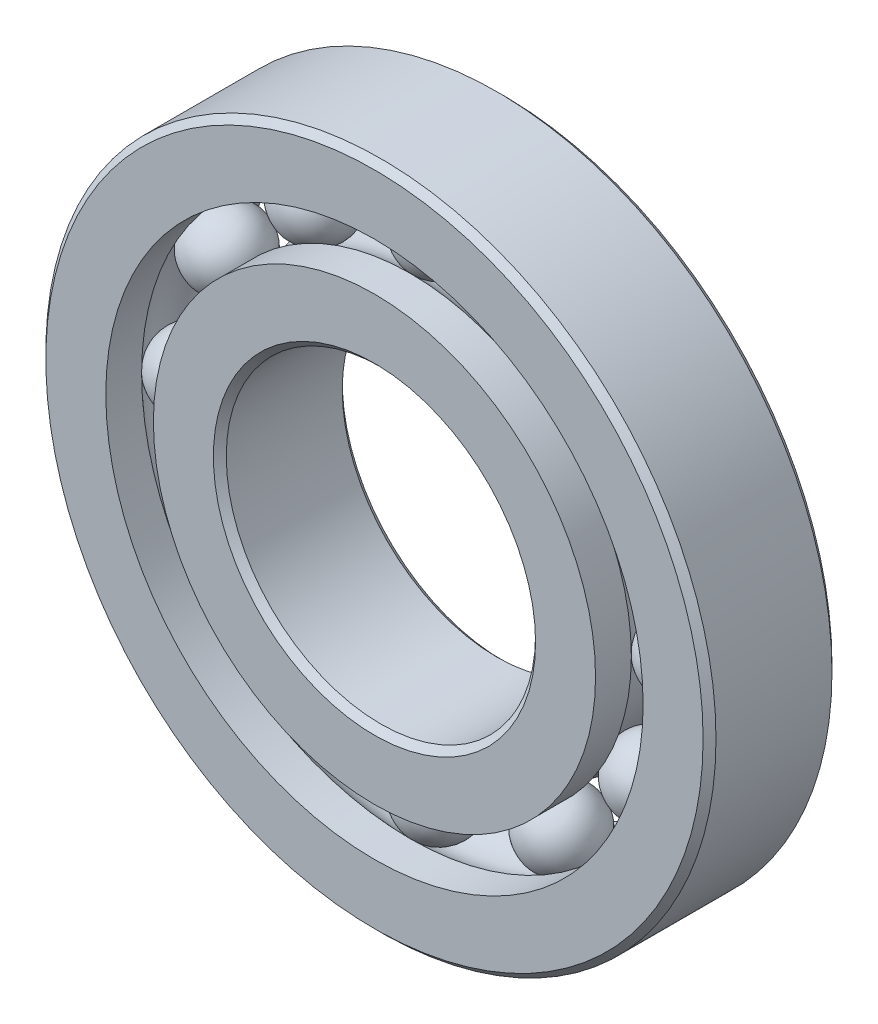
ISO-10303-21;
HEADER;
FILE_DESCRIPTION(('STEP AP214'),'2;1');
FILE_NAME('part.step','',(''),(''),'','','');
FILE_SCHEMA(('AUTOMOTIVE_DESIGN { 1 0 10303 214 1 1 1 1 }'));
ENDSEC;
DATA;
#1=APPLICATION_CONTEXT('core data for automotive mechanical design processes');
#2=APPLICATION_PROTOCOL_DEFINITION('international standard','automotive_design',2000,#1);
#3=PRODUCT_CONTEXT('',#1,'mechanical');
#4=PRODUCT('Part','Part','',(#3));
#5=PRODUCT_RELATED_PRODUCT_CATEGORY('part','',(#4));
#6=PRODUCT_DEFINITION_FORMATION('','',#4);
#7=PRODUCT_DEFINITION_CONTEXT('part definition',#1,'design');
#8=PRODUCT_DEFINITION('design','',#6,#7);
#9=PRODUCT_DEFINITION_SHAPE('','',#8);
#10=(LENGTH_UNIT() NAMED_UNIT(*) SI_UNIT(.MILLI.,.METRE.));
#11=(NAMED_UNIT(*) PLANE_ANGLE_UNIT() SI_UNIT($,.RADIAN.));
#12=(NAMED_UNIT(*) SI_UNIT($,.STERADIAN.) SOLID_ANGLE_UNIT());
#13=UNCERTAINTY_MEASURE_WITH_UNIT(LENGTH_MEASURE(1.E-05),#10,'distance_accuracy_value','');
#14=(GEOMETRIC_REPRESENTATION_CONTEXT(3) GLOBAL_UNCERTAINTY_ASSIGNED_CONTEXT((#13)) GLOBAL_UNIT_ASSIGNED_CONTEXT((#10,
#11,#12)) REPRESENTATION_CONTEXT('',''));
#15=CARTESIAN_POINT('',(0.,0.,0.));
#16=DIRECTION('',(0.,0.,1.));
#17=DIRECTION('',(1.,0.,0.));
#18=AXIS2_PLACEMENT_3D('',#15,#16,#17);
#19=CARTESIAN_POINT('',(-7.54062499999983,13.0607456208242,0.));
#20=DIRECTION('',(0.,0.,1.));
#21=DIRECTION('',(-0.499999999999989,0.866025403784445,0.));
#22=AXIS2_PLACEMENT_3D('',#19,#20,#21);
#23=SPHERICAL_SURFACE('',#22,2.29317598176668);
#24=CARTESIAN_POINT('',(-7.54062499999983,13.0607456208242,2.29317598176668));
#25=VERTEX_POINT('',#24);
#26=VERTEX_LOOP('',#25);
#27=FACE_BOUND('',#26,.T.);
#28=ADVANCED_FACE('F39',(#27),#23,.T.);
#29=CLOSED_SHELL('',(#28));
#30=MANIFOLD_SOLID_BREP('B2',#29);
#31=CARTESIAN_POINT('',(-13.060745620824,7.54062500000015,0.));
#32=DIRECTION('',(0.,0.,1.));
#33=DIRECTION('',(-0.866025403784433,0.50000000000001,0.));
#34=AXIS2_PLACEMENT_3D('',#31,#32,#33);
#35=SPHERICAL_SURFACE('',#34,2.29317598176668);
#36=CARTESIAN_POINT('',(-13.060745620824,7.54062500000015,2.29317598176668));
#37=VERTEX_POINT('',#36);
#38=VERTEX_LOOP('',#37);
#39=FACE_BOUND('',#38,.T.);
#40=ADVANCED_FACE('F59',(#39),#35,.T.);
#41=CLOSED_SHELL('',(#40));
#42=MANIFOLD_SOLID_BREP('B6',#41);
#43=CARTESIAN_POINT('',(-15.08125,1.57967708824284E-13,0.));
#44=DIRECTION('',(0.,0.,1.));
#45=DIRECTION('',(-1.,0.,0.));
#46=AXIS2_PLACEMENT_3D('',#43,#44,#45);
#47=SPHERICAL_SURFACE('',#46,2.29317598176668);
#48=CARTESIAN_POINT('',(-15.08125,1.57967708824284E-13,2.29317598176668));
#49=VERTEX_POINT('',#48);
#50=VERTEX_LOOP('',#49);
#51=FACE_BOUND('',#50,.T.);
#52=ADVANCED_FACE('F79',(#51),#47,.T.);
#53=CLOSED_SHELL('',(#52));
#54=MANIFOLD_SOLID_BREP('B35',#53);
#55=CARTESIAN_POINT('',(-13.0607456208241,-7.54062499999988,0.));
#56=DIRECTION('',(0.,0.,1.));
#57=DIRECTION('',(-0.866025403784443,-0.499999999999992,0.));
#58=AXIS2_PLACEMENT_3D('',#55,#56,#57);
#59=SPHERICAL_SURFACE('',#58,2.29317598176668);
#60=CARTESIAN_POINT('',(-13.0607456208241,-7.54062499999988,2.29317598176668));
#61=VERTEX_POINT('',#60);
#62=VERTEX_LOOP('',#61);
#63=FACE_BOUND('',#62,.T.);
#64=ADVANCED_FACE('F99',(#63),#59,.T.);
#65=CLOSED_SHELL('',(#64));
#66=MANIFOLD_SOLID_BREP('B55',#65);
#67=CARTESIAN_POINT('',(-7.54062500000011,-13.060745620824,0.));
#68=DIRECTION('',(0.,0.,1.));
#69=DIRECTION('',(-0.500000000000007,-0.866025403784435,0.));
#70=AXIS2_PLACEMENT_3D('',#67,#68,#69);
#71=SPHERICAL_SURFACE('',#70,2.29317598176668);
#72=CARTESIAN_POINT('',(-7.54062500000011,-13.060745620824,2.29317598176668));
#73=VERTEX_POINT('',#72);
#74=VERTEX_LOOP('',#73);
#75=FACE_BOUND('',#74,.T.);
#76=ADVANCED_FACE('F119',(#75),#71,.T.);
#77=CLOSED_SHELL('',(#76));
#78=MANIFOLD_SOLID_BREP('B75',#77);
#79=CARTESIAN_POINT('',(-1.05311805882856E-13,-15.08125,0.));
#80=DIRECTION('',(0.,0.,1.));
#81=DIRECTION('',(0.,-1.,0.));
#82=AXIS2_PLACEMENT_3D('',#79,#80,#81);
#83=SPHERICAL_SURFACE('',#82,2.29317598176668);
#84=CARTESIAN_POINT('',(-1.05311805882856E-13,-15.08125,2.29317598176668));
#85=VERTEX_POINT('',#84);
#86=VERTEX_LOOP('',#85);
#87=FACE_BOUND('',#86,.T.);
#88=ADVANCED_FACE('F139',(#87),#83,.T.);
#89=CLOSED_SHELL('',(#88));
#90=MANIFOLD_SOLID_BREP('B95',#89);
#91=CARTESIAN_POINT('',(7.54062499999992,-13.0607456208241,0.));
#92=DIRECTION('',(0.,0.,1.));
#93=DIRECTION('',(0.499999999999995,-0.866025403784442,0.));
#94=AXIS2_PLACEMENT_3D('',#91,#92,#93);
#95=SPHERICAL_SURFACE('',#94,2.29317598176668);
#96=CARTESIAN_POINT('',(7.54062499999992,-13.0607456208241,2.29317598176668));
#97=VERTEX_POINT('',#96);
#98=VERTEX_LOOP('',#97);
#99=FACE_BOUND('',#98,.T.);
#100=ADVANCED_FACE('F159',(#99),#95,.T.);
#101=CLOSED_SHELL('',(#100));
#102=MANIFOLD_SOLID_BREP('B115',#101);
#103=CARTESIAN_POINT('',(13.060745620824,-7.54062500000006,0.));
#104=DIRECTION('',(0.,0.,1.));
#105=DIRECTION('',(0.866025403784436,-0.500000000000004,0.));
#106=AXIS2_PLACEMENT_3D('',#103,#104,#105);
#107=SPHERICAL_SURFACE('',#106,2.29317598176668);
#108=CARTESIAN_POINT('',(13.060745620824,-7.54062500000006,2.29317598176668));
#109=VERTEX_POINT('',#108);
#110=VERTEX_LOOP('',#109);
#111=FACE_BOUND('',#110,.T.);
#112=ADVANCED_FACE('F179',(#111),#107,.T.);
#113=CLOSED_SHELL('',(#112));
#114=MANIFOLD_SOLID_BREP('B135',#113);
#115=CARTESIAN_POINT('',(15.08125,0.,0.));
#116=DIRECTION('',(0.,0.,1.));
#117=DIRECTION('',(1.,0.,0.));
#118=AXIS2_PLACEMENT_3D('',#115,#116,#117);
#119=SPHERICAL_SURFACE('',#118,2.29317598176668);
#120=CARTESIAN_POINT('',(15.08125,0.,2.29317598176668));
#121=VERTEX_POINT('',#120);
#122=VERTEX_LOOP('',#121);
#123=FACE_BOUND('',#122,.T.);
#124=ADVANCED_FACE('F199',(#123),#119,.T.);
#125=CLOSED_SHELL('',(#124));
#126=MANIFOLD_SOLID_BREP('B155',#125);
#127=CARTESIAN_POINT('',(13.0607456208241,7.54062499999997,0.));
#128=DIRECTION('',(0.,0.,1.));
#129=DIRECTION('',(0.86602540378444,0.499999999999998,0.));
#130=AXIS2_PLACEMENT_3D('',#127,#128,#129);
#131=SPHERICAL_SURFACE('',#130,2.29317598176668);
#132=CARTESIAN_POINT('',(13.0607456208241,7.54062499999997,2.29317598176668));
#133=VERTEX_POINT('',#132);
#134=VERTEX_LOOP('',#133);
#135=FACE_BOUND('',#134,.T.);
#136=ADVANCED_FACE('F219',(#135),#131,.T.);
#137=CLOSED_SHELL('',(#136));
#138=MANIFOLD_SOLID_BREP('B175',#137);
#139=CARTESIAN_POINT('',(7.54062500000002,13.0607456208241,0.));
#140=DIRECTION('',(0.,0.,1.));
#141=DIRECTION('',(0.500000000000001,0.866025403784438,0.));
#142=AXIS2_PLACEMENT_3D('',#139,#140,#141);
#143=SPHERICAL_SURFACE('',#142,2.29317598176668);
#144=CARTESIAN_POINT('',(7.54062500000002,13.0607456208241,2.29317598176668));
#145=VERTEX_POINT('',#144);
#146=VERTEX_LOOP('',#145);
#147=FACE_BOUND('',#146,.T.);
#148=ADVANCED_FACE('F239',(#147),#143,.T.);
#149=CLOSED_SHELL('',(#148));
#150=MANIFOLD_SOLID_BREP('B195',#149);
#151=CARTESIAN_POINT('',(0.,15.08125,0.));
#152=DIRECTION('',(0.,0.,1.));
#153=DIRECTION('',(0.,1.,0.));
#154=AXIS2_PLACEMENT_3D('',#151,#152,#153);
#155=SPHERICAL_SURFACE('',#154,2.29317598176668);
#156=CARTESIAN_POINT('',(0.,15.08125,2.29317598176668));
#157=VERTEX_POINT('',#156);
#158=VERTEX_LOOP('',#157);
#159=FACE_BOUND('',#158,.T.);
#160=ADVANCED_FACE('F261',(#159),#155,.T.);
#161=CLOSED_SHELL('',(#160));
#162=MANIFOLD_SOLID_BREP('B215',#161);
#163=CARTESIAN_POINT('',(0.,13.6158653846154,3.96875));
#164=DIRECTION('',(0.,0.,-1.));
#165=DIRECTION('',(-1.,0.,0.));
#166=AXIS2_PLACEMENT_3D('',#163,#164,#165);
#167=PLANE('',#166);
#168=CARTESIAN_POINT('',(0.,0.,3.96875));
#169=DIRECTION('',(0.,0.,1.));
#170=DIRECTION('',(1.,0.,0.));
#171=AXIS2_PLACEMENT_3D('',#168,#169,#170);
#172=CIRCLE('',#171,9.921875);
#173=CARTESIAN_POINT('',(9.921875,0.,3.96875));
#174=VERTEX_POINT('',#173);
#175=EDGE_CURVE('E308',#174,#174,#172,.T.);
#176=ORIENTED_EDGE('',*,*,#175,.F.);
#177=EDGE_LOOP('',(#176));
#178=FACE_BOUND('',#177,.T.);
#179=CARTESIAN_POINT('',(0.,0.,3.96875));
#180=DIRECTION('',(0.,0.,1.));
#181=DIRECTION('',(1.,0.,0.));
#182=AXIS2_PLACEMENT_3D('',#179,#180,#181);
#183=CIRCLE('',#182,13.6158653846154);
#184=CARTESIAN_POINT('',(13.6158653846154,0.,3.96875));
#185=VERTEX_POINT('',#184);
#186=EDGE_CURVE('E260',#185,#185,#183,.T.);
#187=ORIENTED_EDGE('',*,*,#186,.T.);
#188=EDGE_LOOP('',(#187));
#189=FACE_BOUND('',#188,.T.);
#190=ADVANCED_FACE('F280',(#178,#189),#167,.F.);
#191=CARTESIAN_POINT('',(0.,0.,3.96875));
#192=DIRECTION('',(0.,0.,1.));
#193=DIRECTION('',(1.,0.,0.));
#194=AXIS2_PLACEMENT_3D('',#191,#192,#193);
#195=CYLINDRICAL_SURFACE('',#194,13.6158653846154);
#196=ORIENTED_EDGE('',*,*,#186,.F.);
#197=EDGE_LOOP('',(#196));
#198=FACE_BOUND('',#197,.T.);
#199=CARTESIAN_POINT('',(0.,0.,1.76388888888889));
#200=DIRECTION('',(0.,0.,1.));
#201=DIRECTION('',(1.,0.,0.));
#202=AXIS2_PLACEMENT_3D('',#199,#200,#201);
#203=CIRCLE('',#202,13.6158653846154);
#204=CARTESIAN_POINT('',(13.6158653846154,0.,1.76388888888889));
#205=VERTEX_POINT('',#204);
#206=EDGE_CURVE('E286',#205,#205,#203,.T.);
#207=ORIENTED_EDGE('',*,*,#206,.T.);
#208=EDGE_LOOP('',(#207));
#209=FACE_BOUND('',#208,.T.);
#210=ADVANCED_FACE('F315',(#198,#209),#195,.T.);
#211=CARTESIAN_POINT('',(0.,0.,0.));
#212=DIRECTION('',(0.,0.,1.));
#213=DIRECTION('',(1.,0.,0.));
#214=AXIS2_PLACEMENT_3D('',#211,#212,#213);
#215=TOROIDAL_SURFACE('',#214,15.08125,2.29317598176668);
#216=ORIENTED_EDGE('',*,*,#206,.F.);
#217=EDGE_LOOP('',(#216));
#218=FACE_BOUND('',#217,.T.);
#219=CARTESIAN_POINT('',(0.,0.,-1.76388888888889));
#220=DIRECTION('',(0.,0.,1.));
#221=DIRECTION('',(1.,0.,0.));
#222=AXIS2_PLACEMENT_3D('',#219,#220,#221);
#223=CIRCLE('',#222,13.6158653846154);
#224=CARTESIAN_POINT('',(13.6158653846154,0.,-1.76388888888889));
#225=VERTEX_POINT('',#224);
#226=EDGE_CURVE('E290',#225,#225,#223,.T.);
#227=ORIENTED_EDGE('',*,*,#226,.T.);
#228=EDGE_LOOP('',(#227));
#229=FACE_BOUND('',#228,.T.);
#230=ADVANCED_FACE('F319',(#218,#229),#215,.F.);
#231=CARTESIAN_POINT('',(0.,0.,3.96875));
#232=DIRECTION('',(0.,0.,1.));
#233=DIRECTION('',(1.,0.,0.));
#234=AXIS2_PLACEMENT_3D('',#231,#232,#233);
#235=CYLINDRICAL_SURFACE('',#234,13.6158653846154);
#236=ORIENTED_EDGE('',*,*,#226,.F.);
#237=EDGE_LOOP('',(#236));
#238=FACE_BOUND('',#237,.T.);
#239=CARTESIAN_POINT('',(0.,0.,-3.96875));
#240=DIRECTION('',(0.,0.,1.));
#241=DIRECTION('',(1.,0.,0.));
#242=AXIS2_PLACEMENT_3D('',#239,#240,#241);
#243=CIRCLE('',#242,13.6158653846154);
#244=CARTESIAN_POINT('',(13.6158653846154,0.,-3.96875));
#245=VERTEX_POINT('',#244);
#246=EDGE_CURVE('E294',#245,#245,#243,.T.);
#247=ORIENTED_EDGE('',*,*,#246,.T.);
#248=EDGE_LOOP('',(#247));
#249=FACE_BOUND('',#248,.T.);
#250=ADVANCED_FACE('F324',(#238,#249),#235,.T.);
#251=CARTESIAN_POINT('',(0.,9.921875,-3.96875));
#252=DIRECTION('',(0.,0.,1.));
#253=DIRECTION('',(1.,0.,0.));
#254=AXIS2_PLACEMENT_3D('',#251,#252,#253);
#255=PLANE('',#254);
#256=ORIENTED_EDGE('',*,*,#246,.F.);
#257=EDGE_LOOP('',(#256));
#258=FACE_BOUND('',#257,.T.);
#259=CARTESIAN_POINT('',(0.,0.,-3.96875));
#260=DIRECTION('',(0.,0.,1.));
#261=DIRECTION('',(1.,0.,0.));
#262=AXIS2_PLACEMENT_3D('',#259,#260,#261);
#263=CIRCLE('',#262,9.921875);
#264=CARTESIAN_POINT('',(9.921875,0.,-3.96875));
#265=VERTEX_POINT('',#264);
#266=EDGE_CURVE('E299',#265,#265,#263,.T.);
#267=ORIENTED_EDGE('',*,*,#266,.T.);
#268=EDGE_LOOP('',(#267));
#269=FACE_BOUND('',#268,.T.);
#270=ADVANCED_FACE('F330',(#258,#269),#255,.F.);
#271=CARTESIAN_POINT('',(0.,0.,-3.571875));
#272=DIRECTION('',(0.,0.,-1.));
#273=DIRECTION('',(-1.,0.,0.));
#274=AXIS2_PLACEMENT_3D('',#271,#272,#273);
#275=CONICAL_SURFACE('',#274,9.525,0.785398163397448);
#276=ORIENTED_EDGE('',*,*,#266,.F.);
#277=EDGE_LOOP('',(#276));
#278=FACE_BOUND('',#277,.T.);
#279=CARTESIAN_POINT('',(0.,0.,-3.571875));
#280=DIRECTION('',(0.,0.,1.));
#281=DIRECTION('',(1.,0.,0.));
#282=AXIS2_PLACEMENT_3D('',#279,#280,#281);
#283=CIRCLE('',#282,9.525);
#284=CARTESIAN_POINT('',(9.525,0.,-3.571875));
#285=VERTEX_POINT('',#284);
#286=EDGE_CURVE('E302',#285,#285,#283,.T.);
#287=ORIENTED_EDGE('',*,*,#286,.T.);
#288=EDGE_LOOP('',(#287));
#289=FACE_BOUND('',#288,.T.);
#290=ADVANCED_FACE('F334',(#278,#289),#275,.F.);
#291=CARTESIAN_POINT('',(0.,0.,3.96875));
#292=DIRECTION('',(0.,0.,1.));
#293=DIRECTION('',(1.,0.,0.));
#294=AXIS2_PLACEMENT_3D('',#291,#292,#293);
#295=CYLINDRICAL_SURFACE('',#294,9.525);
#296=ORIENTED_EDGE('',*,*,#286,.F.);
#297=EDGE_LOOP('',(#296));
#298=FACE_BOUND('',#297,.T.);
#299=CARTESIAN_POINT('',(0.,0.,3.571875));
#300=DIRECTION('',(0.,0.,1.));
#301=DIRECTION('',(1.,0.,0.));
#302=AXIS2_PLACEMENT_3D('',#299,#300,#301);
#303=CIRCLE('',#302,9.525);
#304=CARTESIAN_POINT('',(9.525,0.,3.571875));
#305=VERTEX_POINT('',#304);
#306=EDGE_CURVE('E305',#305,#305,#303,.T.);
#307=ORIENTED_EDGE('',*,*,#306,.T.);
#308=EDGE_LOOP('',(#307));
#309=FACE_BOUND('',#308,.T.);
#310=ADVANCED_FACE('F338',(#298,#309),#295,.F.);
#311=CARTESIAN_POINT('',(0.,0.,3.96875));
#312=DIRECTION('',(0.,0.,1.));
#313=DIRECTION('',(1.,0.,0.));
#314=AXIS2_PLACEMENT_3D('',#311,#312,#313);
#315=CONICAL_SURFACE('',#314,9.921875,0.785398163397447);
#316=ORIENTED_EDGE('',*,*,#306,.F.);
#317=EDGE_LOOP('',(#316));
#318=FACE_BOUND('',#317,.T.);
#319=ORIENTED_EDGE('',*,*,#175,.T.);
#320=EDGE_LOOP('',(#319));
#321=FACE_BOUND('',#320,.T.);
#322=ADVANCED_FACE('F312',(#318,#321),#315,.F.);
#323=CLOSED_SHELL('',(#190,#210,#230,#250,#270,#290,#310,#322));
#324=MANIFOLD_SOLID_BREP('B235',#323);
#325=CARTESIAN_POINT('',(0.,0.,3.571875));
#326=DIRECTION('',(0.,0.,-1.));
#327=DIRECTION('',(-1.,0.,0.));
#328=AXIS2_PLACEMENT_3D('',#325,#326,#327);
#329=CONICAL_SURFACE('',#328,20.6375,0.785398163397446);
#330=CARTESIAN_POINT('',(0.,0.,3.96875));
#331=DIRECTION('',(0.,0.,1.));
#332=DIRECTION('',(1.,0.,0.));
#333=AXIS2_PLACEMENT_3D('',#330,#331,#332);
#334=CIRCLE('',#333,20.240625);
#335=CARTESIAN_POINT('',(20.240625,0.,3.96875));
#336=VERTEX_POINT('',#335);
#337=EDGE_CURVE('E429',#336,#336,#334,.T.);
#338=ORIENTED_EDGE('',*,*,#337,.F.);
#339=EDGE_LOOP('',(#338));
#340=FACE_BOUND('',#339,.T.);
#341=CARTESIAN_POINT('',(0.,0.,3.571875));
#342=DIRECTION('',(0.,0.,1.));
#343=DIRECTION('',(1.,0.,0.));
#344=AXIS2_PLACEMENT_3D('',#341,#342,#343);
#345=CIRCLE('',#344,20.6375);
#346=CARTESIAN_POINT('',(20.6375,0.,3.571875));
#347=VERTEX_POINT('',#346);
#348=EDGE_CURVE('E279',#347,#347,#345,.T.);
#349=ORIENTED_EDGE('',*,*,#348,.T.);
#350=EDGE_LOOP('',(#349));
#351=FACE_BOUND('',#350,.T.);
#352=ADVANCED_FACE('F401',(#340,#351),#329,.T.);
#353=CARTESIAN_POINT('',(0.,0.,3.96875));
#354=DIRECTION('',(0.,0.,1.));
#355=DIRECTION('',(1.,0.,0.));
#356=AXIS2_PLACEMENT_3D('',#353,#354,#355);
#357=CYLINDRICAL_SURFACE('',#356,20.6375);
#358=ORIENTED_EDGE('',*,*,#348,.F.);
#359=EDGE_LOOP('',(#358));
#360=FACE_BOUND('',#359,.T.);
#361=CARTESIAN_POINT('',(0.,0.,-3.571875));
#362=DIRECTION('',(0.,0.,1.));
#363=DIRECTION('',(1.,0.,0.));
#364=AXIS2_PLACEMENT_3D('',#361,#362,#363);
#365=CIRCLE('',#364,20.6375);
#366=CARTESIAN_POINT('',(20.6375,0.,-3.571875));
#367=VERTEX_POINT('',#366);
#368=EDGE_CURVE('E407',#367,#367,#365,.T.);
#369=ORIENTED_EDGE('',*,*,#368,.T.);
#370=EDGE_LOOP('',(#369));
#371=FACE_BOUND('',#370,.T.);
#372=ADVANCED_FACE('F436',(#360,#371),#357,.T.);
#373=CARTESIAN_POINT('',(0.,0.,-3.96875));
#374=DIRECTION('',(0.,0.,1.));
#375=DIRECTION('',(1.,0.,0.));
#376=AXIS2_PLACEMENT_3D('',#373,#374,#375);
#377=CONICAL_SURFACE('',#376,20.240625,0.785398163397446);
#378=ORIENTED_EDGE('',*,*,#368,.F.);
#379=EDGE_LOOP('',(#378));
#380=FACE_BOUND('',#379,.T.);
#381=CARTESIAN_POINT('',(0.,0.,-3.96875));
#382=DIRECTION('',(0.,0.,1.));
#383=DIRECTION('',(1.,0.,0.));
#384=AXIS2_PLACEMENT_3D('',#381,#382,#383);
#385=CIRCLE('',#384,20.240625);
#386=CARTESIAN_POINT('',(20.240625,0.,-3.96875));
#387=VERTEX_POINT('',#386);
#388=EDGE_CURVE('E411',#387,#387,#385,.T.);
#389=ORIENTED_EDGE('',*,*,#388,.T.);
#390=EDGE_LOOP('',(#389));
#391=FACE_BOUND('',#390,.T.);
#392=ADVANCED_FACE('F440',(#380,#391),#377,.T.);
#393=CARTESIAN_POINT('',(0.,20.240625,-3.96875));
#394=DIRECTION('',(0.,0.,1.));
#395=DIRECTION('',(1.,0.,0.));
#396=AXIS2_PLACEMENT_3D('',#393,#394,#395);
#397=PLANE('',#396);
#398=ORIENTED_EDGE('',*,*,#388,.F.);
#399=EDGE_LOOP('',(#398));
#400=FACE_BOUND('',#399,.T.);
#401=CARTESIAN_POINT('',(0.,0.,-3.96875));
#402=DIRECTION('',(0.,0.,1.));
#403=DIRECTION('',(1.,0.,0.));
#404=AXIS2_PLACEMENT_3D('',#401,#402,#403);
#405=CIRCLE('',#404,16.5466346153846);
#406=CARTESIAN_POINT('',(16.5466346153846,0.,-3.96875));
#407=VERTEX_POINT('',#406);
#408=EDGE_CURVE('E415',#407,#407,#405,.T.);
#409=ORIENTED_EDGE('',*,*,#408,.T.);
#410=EDGE_LOOP('',(#409));
#411=FACE_BOUND('',#410,.T.);
#412=ADVANCED_FACE('F445',(#400,#411),#397,.F.);
#413=CARTESIAN_POINT('',(0.,0.,3.96875));
#414=DIRECTION('',(0.,0.,1.));
#415=DIRECTION('',(1.,0.,0.));
#416=AXIS2_PLACEMENT_3D('',#413,#414,#415);
#417=CYLINDRICAL_SURFACE('',#416,16.5466346153846);
#418=ORIENTED_EDGE('',*,*,#408,.F.);
#419=EDGE_LOOP('',(#418));
#420=FACE_BOUND('',#419,.T.);
#421=CARTESIAN_POINT('',(0.,0.,-1.76388888888889));
#422=DIRECTION('',(0.,0.,1.));
#423=DIRECTION('',(1.,0.,0.));
#424=AXIS2_PLACEMENT_3D('',#421,#422,#423);
#425=CIRCLE('',#424,16.5466346153846);
#426=CARTESIAN_POINT('',(16.5466346153846,0.,-1.76388888888889));
#427=VERTEX_POINT('',#426);
#428=EDGE_CURVE('E420',#427,#427,#425,.T.);
#429=ORIENTED_EDGE('',*,*,#428,.T.);
#430=EDGE_LOOP('',(#429));
#431=FACE_BOUND('',#430,.T.);
#432=ADVANCED_FACE('F451',(#420,#431),#417,.F.);
#433=CARTESIAN_POINT('',(0.,0.,0.));
#434=DIRECTION('',(0.,0.,1.));
#435=DIRECTION('',(1.,0.,0.));
#436=AXIS2_PLACEMENT_3D('',#433,#434,#435);
#437=TOROIDAL_SURFACE('',#436,15.08125,2.29317598176668);
#438=ORIENTED_EDGE('',*,*,#428,.F.);
#439=EDGE_LOOP('',(#438));
#440=FACE_BOUND('',#439,.T.);
#441=CARTESIAN_POINT('',(0.,0.,1.76388888888889));
#442=DIRECTION('',(0.,0.,1.));
#443=DIRECTION('',(1.,0.,0.));
#444=AXIS2_PLACEMENT_3D('',#441,#442,#443);
#445=CIRCLE('',#444,16.5466346153846);
#446=CARTESIAN_POINT('',(16.5466346153846,0.,1.76388888888889));
#447=VERTEX_POINT('',#446);
#448=EDGE_CURVE('E423',#447,#447,#445,.T.);
#449=ORIENTED_EDGE('',*,*,#448,.T.);
#450=EDGE_LOOP('',(#449));
#451=FACE_BOUND('',#450,.T.);
#452=ADVANCED_FACE('F455',(#440,#451),#437,.F.);
#453=CARTESIAN_POINT('',(0.,0.,3.96875));
#454=DIRECTION('',(0.,0.,1.));
#455=DIRECTION('',(1.,0.,0.));
#456=AXIS2_PLACEMENT_3D('',#453,#454,#455);
#457=CYLINDRICAL_SURFACE('',#456,16.5466346153846);
#458=ORIENTED_EDGE('',*,*,#448,.F.);
#459=EDGE_LOOP('',(#458));
#460=FACE_BOUND('',#459,.T.);
#461=CARTESIAN_POINT('',(0.,0.,3.96875));
#462=DIRECTION('',(0.,0.,1.));
#463=DIRECTION('',(1.,0.,0.));
#464=AXIS2_PLACEMENT_3D('',#461,#462,#463);
#465=CIRCLE('',#464,16.5466346153846);
#466=CARTESIAN_POINT('',(16.5466346153846,0.,3.96875));
#467=VERTEX_POINT('',#466);
#468=EDGE_CURVE('E426',#467,#467,#465,.T.);
#469=ORIENTED_EDGE('',*,*,#468,.T.);
#470=EDGE_LOOP('',(#469));
#471=FACE_BOUND('',#470,.T.);
#472=ADVANCED_FACE('F459',(#460,#471),#457,.F.);
#473=CARTESIAN_POINT('',(0.,20.240625,3.96875));
#474=DIRECTION('',(0.,0.,-1.));
#475=DIRECTION('',(-1.,0.,0.));
#476=AXIS2_PLACEMENT_3D('',#473,#474,#475);
#477=PLANE('',#476);
#478=ORIENTED_EDGE('',*,*,#468,.F.);
#479=EDGE_LOOP('',(#478));
#480=FACE_BOUND('',#479,.T.);
#481=ORIENTED_EDGE('',*,*,#337,.T.);
#482=EDGE_LOOP('',(#481));
#483=FACE_BOUND('',#482,.T.);
#484=ADVANCED_FACE('F433',(#480,#483),#477,.F.);
#485=CLOSED_SHELL('',(#352,#372,#392,#412,#432,#452,#472,#484));
#486=MANIFOLD_SOLID_BREP('B255',#485);
#487=ADVANCED_BREP_SHAPE_REPRESENTATION('',(#18,#30,#42,#54,#66,#78,#90,#102,#114,#126,#138,
#150,#162,#324,#486),#14);
#488=SHAPE_DEFINITION_REPRESENTATION(#9,#487);
ENDSEC;
END-ISO-10303-21;
